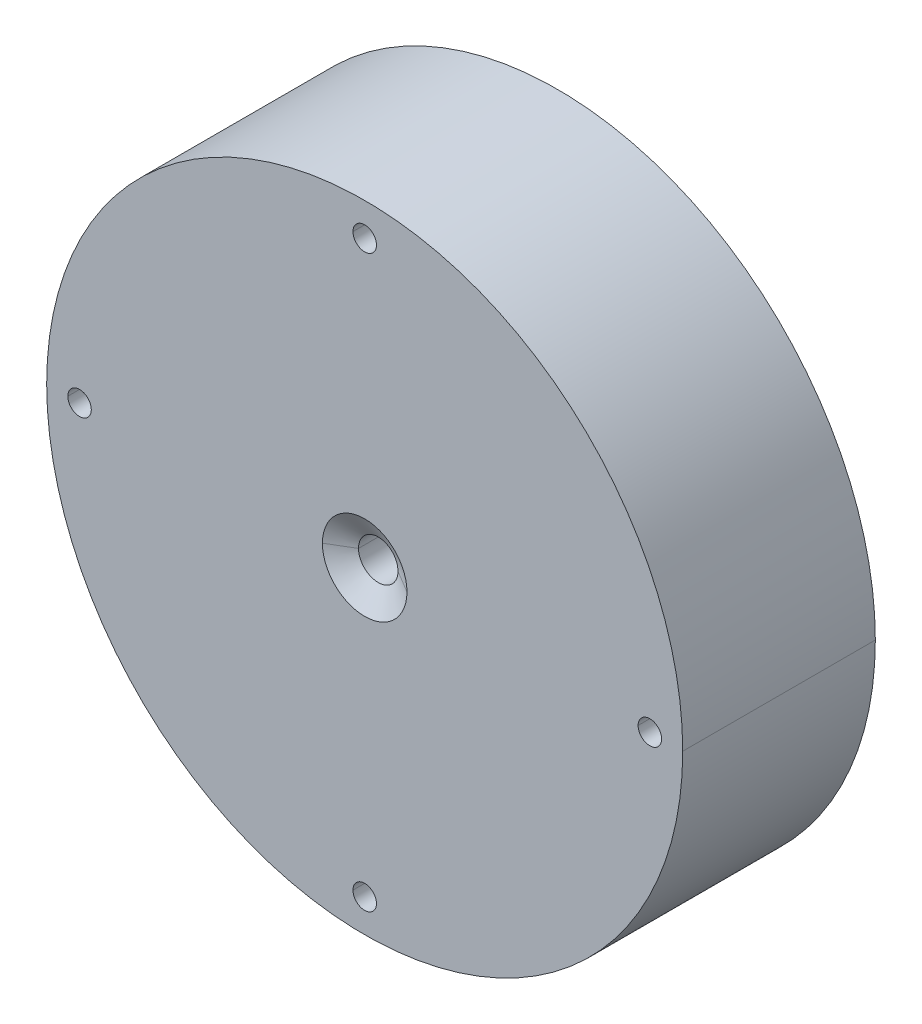
ISO-10303-21;
HEADER;
FILE_DESCRIPTION(('STEP AP214'),'2;1');
FILE_NAME('part.step','',(''),(''),'','','');
FILE_SCHEMA(('AUTOMOTIVE_DESIGN { 1 0 10303 214 1 1 1 1 }'));
ENDSEC;
DATA;
#1=APPLICATION_CONTEXT('core data for automotive mechanical design processes');
#2=APPLICATION_PROTOCOL_DEFINITION('international standard','automotive_design',2000,#1);
#3=PRODUCT_CONTEXT('',#1,'mechanical');
#4=PRODUCT('Part','Part','',(#3));
#5=PRODUCT_RELATED_PRODUCT_CATEGORY('part','',(#4));
#6=PRODUCT_DEFINITION_FORMATION('','',#4);
#7=PRODUCT_DEFINITION_CONTEXT('part definition',#1,'design');
#8=PRODUCT_DEFINITION('design','',#6,#7);
#9=PRODUCT_DEFINITION_SHAPE('','',#8);
#10=(LENGTH_UNIT() NAMED_UNIT(*) SI_UNIT(.MILLI.,.METRE.));
#11=(NAMED_UNIT(*) PLANE_ANGLE_UNIT() SI_UNIT($,.RADIAN.));
#12=(NAMED_UNIT(*) SI_UNIT($,.STERADIAN.) SOLID_ANGLE_UNIT());
#13=UNCERTAINTY_MEASURE_WITH_UNIT(LENGTH_MEASURE(1.E-05),#10,'distance_accuracy_value','');
#14=(GEOMETRIC_REPRESENTATION_CONTEXT(3) GLOBAL_UNCERTAINTY_ASSIGNED_CONTEXT((#13)) GLOBAL_UNIT_ASSIGNED_CONTEXT((#10,
#11,#12)) REPRESENTATION_CONTEXT('',''));
#15=CARTESIAN_POINT('',(0.,0.,0.));
#16=DIRECTION('',(0.,0.,1.));
#17=DIRECTION('',(1.,0.,0.));
#18=AXIS2_PLACEMENT_3D('',#15,#16,#17);
#19=CARTESIAN_POINT('',(0.,0.,0.));
#20=DIRECTION('',(0.,0.,-1.));
#21=DIRECTION('',(-1.,0.,0.));
#22=AXIS2_PLACEMENT_3D('',#19,#20,#21);
#23=CONICAL_SURFACE('',#22,4.5,1.02974425867666);
#24=CARTESIAN_POINT('',(0.,0.,1.44206548566615));
#25=DIRECTION('',(0.,0.,-1.));
#26=DIRECTION('',(1.,0.,0.));
#27=AXIS2_PLACEMENT_3D('',#24,#25,#26);
#28=CIRCLE('',#27,2.1);
#29=CARTESIAN_POINT('',(2.1,0.,1.44206548566615));
#30=VERTEX_POINT('',#29);
#31=CARTESIAN_POINT('',(-2.1,0.,1.44206548566615));
#32=VERTEX_POINT('',#31);
#33=EDGE_CURVE('E42',#30,#32,#28,.T.);
#34=ORIENTED_EDGE('',*,*,#33,.F.);
#35=DIRECTION('',(0.857167300702113,0.,-0.515038074910053));
#36=VECTOR('',#35,1.);
#37=CARTESIAN_POINT('',(4.5,0.,0.));
#38=LINE('',#37,#36);
#39=CARTESIAN_POINT('',(4.5,0.,0.));
#40=VERTEX_POINT('',#39);
#41=EDGE_CURVE('E11',#30,#40,#38,.T.);
#42=ORIENTED_EDGE('',*,*,#41,.T.);
#43=CARTESIAN_POINT('',(0.,0.,0.));
#44=DIRECTION('',(0.,0.,1.));
#45=DIRECTION('',(1.,0.,0.));
#46=AXIS2_PLACEMENT_3D('',#43,#44,#45);
#47=CIRCLE('',#46,4.5);
#48=CARTESIAN_POINT('',(-4.5,0.,0.));
#49=VERTEX_POINT('',#48);
#50=EDGE_CURVE('E175',#49,#40,#47,.T.);
#51=ORIENTED_EDGE('',*,*,#50,.F.);
#52=DIRECTION('',(-0.857167300702113,0.,-0.515038074910053));
#53=VECTOR('',#52,1.);
#54=CARTESIAN_POINT('',(-4.5,0.,0.));
#55=LINE('',#54,#53);
#56=EDGE_CURVE('E163',#32,#49,#55,.T.);
#57=ORIENTED_EDGE('',*,*,#56,.F.);
#58=EDGE_LOOP('',(#34,#42,#51,#57));
#59=FACE_BOUND('',#58,.T.);
#60=ADVANCED_FACE('F17',(#59),#23,.F.);
#61=CARTESIAN_POINT('',(30.35,3.1789956002901E-13,20.5));
#62=DIRECTION('',(0.,0.,1.));
#63=DIRECTION('',(1.,0.,0.));
#64=AXIS2_PLACEMENT_3D('',#61,#62,#63);
#65=CYLINDRICAL_SURFACE('',#64,1.24999999999998);
#66=CARTESIAN_POINT('',(30.35,3.1789956002901E-13,0.));
#67=DIRECTION('',(0.,0.,1.));
#68=DIRECTION('',(1.,0.,0.));
#69=AXIS2_PLACEMENT_3D('',#66,#67,#68);
#70=CIRCLE('',#69,1.25);
#71=CARTESIAN_POINT('',(29.1,3.18052640878903E-13,0.));
#72=VERTEX_POINT('',#71);
#73=CARTESIAN_POINT('',(31.6,3.1789956002901E-13,0.));
#74=VERTEX_POINT('',#73);
#75=EDGE_CURVE('E21',#72,#74,#70,.T.);
#76=ORIENTED_EDGE('',*,*,#75,.F.);
#77=DIRECTION('',(0.,0.,1.));
#78=VECTOR('',#77,1.);
#79=CARTESIAN_POINT('',(29.1,3.18052640878903E-13,20.5));
#80=LINE('',#79,#78);
#81=CARTESIAN_POINT('',(29.1,3.18052640878903E-13,20.5));
#82=VERTEX_POINT('',#81);
#83=EDGE_CURVE('E28',#72,#82,#80,.T.);
#84=ORIENTED_EDGE('',*,*,#83,.T.);
#85=CARTESIAN_POINT('',(30.35,3.1789956002901E-13,20.5));
#86=DIRECTION('',(0.,0.,1.));
#87=DIRECTION('',(1.,0.,0.));
#88=AXIS2_PLACEMENT_3D('',#85,#86,#87);
#89=CIRCLE('',#88,1.24999999999998);
#90=CARTESIAN_POINT('',(31.6,3.1789956002901E-13,20.5));
#91=VERTEX_POINT('',#90);
#92=EDGE_CURVE('E218',#82,#91,#89,.T.);
#93=ORIENTED_EDGE('',*,*,#92,.T.);
#94=DIRECTION('',(0.,0.,1.));
#95=VECTOR('',#94,1.);
#96=CARTESIAN_POINT('',(31.6,3.1789956002901E-13,20.5));
#97=LINE('',#96,#95);
#98=EDGE_CURVE('E251',#74,#91,#97,.T.);
#99=ORIENTED_EDGE('',*,*,#98,.F.);
#100=EDGE_LOOP('',(#76,#84,#93,#99));
#101=FACE_BOUND('',#100,.T.);
#102=ADVANCED_FACE('F297',(#101),#65,.F.);
#103=CARTESIAN_POINT('',(2.11933040019339E-13,-30.35,20.5));
#104=DIRECTION('',(0.,0.,1.));
#105=DIRECTION('',(1.,0.,0.));
#106=AXIS2_PLACEMENT_3D('',#103,#104,#105);
#107=CYLINDRICAL_SURFACE('',#106,1.25);
#108=CARTESIAN_POINT('',(2.11933040019339E-13,-30.35,0.));
#109=DIRECTION('',(0.,0.,1.));
#110=DIRECTION('',(1.,0.,0.));
#111=AXIS2_PLACEMENT_3D('',#108,#109,#110);
#112=CIRCLE('',#111,1.25);
#113=CARTESIAN_POINT('',(-1.24999999999978,-30.35,0.));
#114=VERTEX_POINT('',#113);
#115=CARTESIAN_POINT('',(1.25000000000021,-30.35,0.));
#116=VERTEX_POINT('',#115);
#117=EDGE_CURVE('E262',#114,#116,#112,.T.);
#118=ORIENTED_EDGE('',*,*,#117,.F.);
#119=DIRECTION('',(0.,0.,1.));
#120=VECTOR('',#119,1.);
#121=CARTESIAN_POINT('',(-1.24999999999978,-30.35,20.5));
#122=LINE('',#121,#120);
#123=CARTESIAN_POINT('',(-1.24999999999978,-30.35,20.5));
#124=VERTEX_POINT('',#123);
#125=EDGE_CURVE('E237',#114,#124,#122,.T.);
#126=ORIENTED_EDGE('',*,*,#125,.T.);
#127=CARTESIAN_POINT('',(2.11933040019339E-13,-30.35,20.5));
#128=DIRECTION('',(0.,0.,1.));
#129=DIRECTION('',(1.,0.,0.));
#130=AXIS2_PLACEMENT_3D('',#127,#128,#129);
#131=CIRCLE('',#130,1.24999999999999);
#132=CARTESIAN_POINT('',(1.2500000000002,-30.35,20.5));
#133=VERTEX_POINT('',#132);
#134=EDGE_CURVE('E233',#124,#133,#131,.T.);
#135=ORIENTED_EDGE('',*,*,#134,.T.);
#136=DIRECTION('',(0.,0.,1.));
#137=VECTOR('',#136,1.);
#138=CARTESIAN_POINT('',(1.2500000000002,-30.35,20.5));
#139=LINE('',#138,#137);
#140=EDGE_CURVE('E211',#116,#133,#139,.T.);
#141=ORIENTED_EDGE('',*,*,#140,.F.);
#142=EDGE_LOOP('',(#118,#126,#135,#141));
#143=FACE_BOUND('',#142,.T.);
#144=ADVANCED_FACE('F389',(#143),#107,.F.);
#145=CARTESIAN_POINT('',(-30.35,-1.0596652000967E-13,20.5));
#146=DIRECTION('',(0.,0.,1.));
#147=DIRECTION('',(1.,0.,0.));
#148=AXIS2_PLACEMENT_3D('',#145,#146,#147);
#149=CYLINDRICAL_SURFACE('',#148,1.25);
#150=CARTESIAN_POINT('',(-30.35,-1.0596652000967E-13,0.));
#151=DIRECTION('',(0.,0.,1.));
#152=DIRECTION('',(1.,0.,0.));
#153=AXIS2_PLACEMENT_3D('',#150,#151,#152);
#154=CIRCLE('',#153,1.25);
#155=CARTESIAN_POINT('',(-31.6,-1.05813439159776E-13,0.));
#156=VERTEX_POINT('',#155);
#157=CARTESIAN_POINT('',(-29.1,-1.0596652000967E-13,0.));
#158=VERTEX_POINT('',#157);
#159=EDGE_CURVE('E239',#156,#158,#154,.T.);
#160=ORIENTED_EDGE('',*,*,#159,.F.);
#161=DIRECTION('',(0.,0.,1.));
#162=VECTOR('',#161,1.);
#163=CARTESIAN_POINT('',(-31.6,-1.05813439159776E-13,20.5));
#164=LINE('',#163,#162);
#165=CARTESIAN_POINT('',(-31.6,-1.05813439159776E-13,20.5));
#166=VERTEX_POINT('',#165);
#167=EDGE_CURVE('E238',#156,#166,#164,.T.);
#168=ORIENTED_EDGE('',*,*,#167,.T.);
#169=CARTESIAN_POINT('',(-30.35,-1.0596652000967E-13,20.5));
#170=DIRECTION('',(0.,0.,1.));
#171=DIRECTION('',(1.,0.,0.));
#172=AXIS2_PLACEMENT_3D('',#169,#170,#171);
#173=CIRCLE('',#172,1.24999999999999);
#174=CARTESIAN_POINT('',(-29.1,-1.0596652000967E-13,20.5));
#175=VERTEX_POINT('',#174);
#176=EDGE_CURVE('E270',#166,#175,#173,.T.);
#177=ORIENTED_EDGE('',*,*,#176,.T.);
#178=DIRECTION('',(0.,0.,1.));
#179=VECTOR('',#178,1.);
#180=CARTESIAN_POINT('',(-29.1,-1.0596652000967E-13,20.5));
#181=LINE('',#180,#179);
#182=EDGE_CURVE('E210',#158,#175,#181,.T.);
#183=ORIENTED_EDGE('',*,*,#182,.F.);
#184=EDGE_LOOP('',(#160,#168,#177,#183));
#185=FACE_BOUND('',#184,.T.);
#186=ADVANCED_FACE('F338',(#185),#149,.F.);
#187=CARTESIAN_POINT('',(0.,30.35,20.5));
#188=DIRECTION('',(0.,0.,1.));
#189=DIRECTION('',(1.,0.,0.));
#190=AXIS2_PLACEMENT_3D('',#187,#188,#189);
#191=CYLINDRICAL_SURFACE('',#190,1.25);
#192=CARTESIAN_POINT('',(0.,30.35,0.));
#193=DIRECTION('',(0.,0.,1.));
#194=DIRECTION('',(1.,0.,0.));
#195=AXIS2_PLACEMENT_3D('',#192,#193,#194);
#196=CIRCLE('',#195,1.25);
#197=CARTESIAN_POINT('',(-1.25,30.35,0.));
#198=VERTEX_POINT('',#197);
#199=CARTESIAN_POINT('',(1.25,30.35,0.));
#200=VERTEX_POINT('',#199);
#201=EDGE_CURVE('E250',#198,#200,#196,.T.);
#202=ORIENTED_EDGE('',*,*,#201,.F.);
#203=DIRECTION('',(0.,0.,1.));
#204=VECTOR('',#203,1.);
#205=CARTESIAN_POINT('',(-1.25,30.35,20.5));
#206=LINE('',#205,#204);
#207=CARTESIAN_POINT('',(-1.24999999999999,30.35,20.5));
#208=VERTEX_POINT('',#207);
#209=EDGE_CURVE('E267',#198,#208,#206,.T.);
#210=ORIENTED_EDGE('',*,*,#209,.T.);
#211=CARTESIAN_POINT('',(0.,30.35,20.5));
#212=DIRECTION('',(0.,0.,1.));
#213=DIRECTION('',(1.,0.,0.));
#214=AXIS2_PLACEMENT_3D('',#211,#212,#213);
#215=CIRCLE('',#214,1.24999999999999);
#216=CARTESIAN_POINT('',(1.24999999999999,30.35,20.5));
#217=VERTEX_POINT('',#216);
#218=EDGE_CURVE('E123',#208,#217,#215,.T.);
#219=ORIENTED_EDGE('',*,*,#218,.T.);
#220=DIRECTION('',(0.,0.,1.));
#221=VECTOR('',#220,1.);
#222=CARTESIAN_POINT('',(1.25,30.35,20.5));
#223=LINE('',#222,#221);
#224=EDGE_CURVE('E134',#200,#217,#223,.T.);
#225=ORIENTED_EDGE('',*,*,#224,.F.);
#226=EDGE_LOOP('',(#202,#210,#219,#225));
#227=FACE_BOUND('',#226,.T.);
#228=ADVANCED_FACE('F351',(#227),#191,.F.);
#229=CARTESIAN_POINT('',(0.,0.,19.0579345143338));
#230=DIRECTION('',(0.,0.,1.));
#231=DIRECTION('',(1.,0.,0.));
#232=AXIS2_PLACEMENT_3D('',#229,#230,#231);
#233=CONICAL_SURFACE('',#232,2.1,1.02974425867665);
#234=CARTESIAN_POINT('',(0.,0.,19.0579345143338));
#235=DIRECTION('',(0.,0.,1.));
#236=DIRECTION('',(1.,0.,0.));
#237=AXIS2_PLACEMENT_3D('',#234,#235,#236);
#238=CIRCLE('',#237,2.1);
#239=CARTESIAN_POINT('',(-2.1,0.,19.0579345143338));
#240=VERTEX_POINT('',#239);
#241=CARTESIAN_POINT('',(2.1,0.,19.0579345143338));
#242=VERTEX_POINT('',#241);
#243=EDGE_CURVE('E195',#240,#242,#238,.T.);
#244=ORIENTED_EDGE('',*,*,#243,.F.);
#245=DIRECTION('',(-0.857167300702112,0.,0.515038074910055));
#246=VECTOR('',#245,1.);
#247=CARTESIAN_POINT('',(-2.1,0.,19.0579345143338));
#248=LINE('',#247,#246);
#249=CARTESIAN_POINT('',(-4.5,0.,20.5));
#250=VERTEX_POINT('',#249);
#251=EDGE_CURVE('E198',#240,#250,#248,.T.);
#252=ORIENTED_EDGE('',*,*,#251,.T.);
#253=CARTESIAN_POINT('',(0.,0.,20.5));
#254=DIRECTION('',(0.,0.,-1.));
#255=DIRECTION('',(1.,0.,0.));
#256=AXIS2_PLACEMENT_3D('',#253,#254,#255);
#257=CIRCLE('',#256,4.5);
#258=CARTESIAN_POINT('',(4.5,0.,20.5));
#259=VERTEX_POINT('',#258);
#260=EDGE_CURVE('E205',#259,#250,#257,.T.);
#261=ORIENTED_EDGE('',*,*,#260,.F.);
#262=DIRECTION('',(0.857167300702112,0.,0.515038074910055));
#263=VECTOR('',#262,1.);
#264=CARTESIAN_POINT('',(2.1,0.,19.0579345143338));
#265=LINE('',#264,#263);
#266=EDGE_CURVE('E228',#242,#259,#265,.T.);
#267=ORIENTED_EDGE('',*,*,#266,.F.);
#268=EDGE_LOOP('',(#244,#252,#261,#267));
#269=FACE_BOUND('',#268,.T.);
#270=ADVANCED_FACE('F363',(#269),#233,.F.);
#271=CARTESIAN_POINT('',(0.,0.,20.5));
#272=DIRECTION('',(0.,0.,-1.));
#273=DIRECTION('',(-1.,0.,0.));
#274=AXIS2_PLACEMENT_3D('',#271,#272,#273);
#275=CYLINDRICAL_SURFACE('',#274,2.1);
#276=ORIENTED_EDGE('',*,*,#243,.T.);
#277=DIRECTION('',(0.,0.,-1.));
#278=VECTOR('',#277,1.);
#279=CARTESIAN_POINT('',(2.1,0.,20.5));
#280=LINE('',#279,#278);
#281=EDGE_CURVE('E199',#242,#30,#280,.T.);
#282=ORIENTED_EDGE('',*,*,#281,.T.);
#283=ORIENTED_EDGE('',*,*,#33,.T.);
#284=DIRECTION('',(0.,0.,-1.));
#285=VECTOR('',#284,1.);
#286=CARTESIAN_POINT('',(-2.1,0.,20.5));
#287=LINE('',#286,#285);
#288=EDGE_CURVE('E222',#240,#32,#287,.T.);
#289=ORIENTED_EDGE('',*,*,#288,.F.);
#290=EDGE_LOOP('',(#276,#282,#283,#289));
#291=FACE_BOUND('',#290,.T.);
#292=ADVANCED_FACE('F371',(#291),#275,.F.);
#293=CARTESIAN_POINT('',(0.,0.,20.5));
#294=DIRECTION('',(0.,0.,-1.));
#295=DIRECTION('',(-1.,0.,0.));
#296=AXIS2_PLACEMENT_3D('',#293,#294,#295);
#297=CYLINDRICAL_SURFACE('',#296,33.85);
#298=CARTESIAN_POINT('',(0.,0.,20.5));
#299=DIRECTION('',(0.,0.,1.));
#300=DIRECTION('',(1.,0.,0.));
#301=AXIS2_PLACEMENT_3D('',#298,#299,#300);
#302=CIRCLE('',#301,33.85);
#303=CARTESIAN_POINT('',(33.85,0.,20.5));
#304=VERTEX_POINT('',#303);
#305=CARTESIAN_POINT('',(-33.85,0.,20.5));
#306=VERTEX_POINT('',#305);
#307=EDGE_CURVE('E201',#304,#306,#302,.T.);
#308=ORIENTED_EDGE('',*,*,#307,.F.);
#309=DIRECTION('',(0.,0.,-1.));
#310=VECTOR('',#309,1.);
#311=CARTESIAN_POINT('',(33.85,0.,20.5));
#312=LINE('',#311,#310);
#313=CARTESIAN_POINT('',(33.85,0.,0.));
#314=VERTEX_POINT('',#313);
#315=EDGE_CURVE('E221',#304,#314,#312,.T.);
#316=ORIENTED_EDGE('',*,*,#315,.T.);
#317=CARTESIAN_POINT('',(0.,0.,0.));
#318=DIRECTION('',(0.,0.,1.));
#319=DIRECTION('',(1.,0.,0.));
#320=AXIS2_PLACEMENT_3D('',#317,#318,#319);
#321=CIRCLE('',#320,33.85);
#322=CARTESIAN_POINT('',(-33.85,0.,0.));
#323=VERTEX_POINT('',#322);
#324=EDGE_CURVE('E318',#314,#323,#321,.T.);
#325=ORIENTED_EDGE('',*,*,#324,.T.);
#326=DIRECTION('',(0.,0.,-1.));
#327=VECTOR('',#326,1.);
#328=CARTESIAN_POINT('',(-33.85,0.,20.5));
#329=LINE('',#328,#327);
#330=EDGE_CURVE('E278',#306,#323,#329,.T.);
#331=ORIENTED_EDGE('',*,*,#330,.F.);
#332=EDGE_LOOP('',(#308,#316,#325,#331));
#333=FACE_BOUND('',#332,.T.);
#334=ADVANCED_FACE('F354',(#333),#297,.T.);
#335=CARTESIAN_POINT('',(0.,0.,20.5));
#336=DIRECTION('',(0.,0.,1.));
#337=DIRECTION('',(1.,0.,0.));
#338=AXIS2_PLACEMENT_3D('',#335,#336,#337);
#339=PLANE('',#338);
#340=CARTESIAN_POINT('',(0.,0.,20.5));
#341=DIRECTION('',(0.,0.,1.));
#342=DIRECTION('',(1.,0.,0.));
#343=AXIS2_PLACEMENT_3D('',#340,#341,#342);
#344=CIRCLE('',#343,33.85);
#345=EDGE_CURVE('E192',#306,#304,#344,.T.);
#346=ORIENTED_EDGE('',*,*,#345,.T.);
#347=ORIENTED_EDGE('',*,*,#307,.T.);
#348=EDGE_LOOP('',(#346,#347));
#349=FACE_BOUND('',#348,.T.);
#350=CARTESIAN_POINT('',(30.35,3.1789956002901E-13,20.5));
#351=DIRECTION('',(0.,0.,1.));
#352=DIRECTION('',(1.,0.,0.));
#353=AXIS2_PLACEMENT_3D('',#350,#351,#352);
#354=CIRCLE('',#353,1.24999999999998);
#355=EDGE_CURVE('E173',#91,#82,#354,.T.);
#356=ORIENTED_EDGE('',*,*,#355,.F.);
#357=ORIENTED_EDGE('',*,*,#92,.F.);
#358=EDGE_LOOP('',(#356,#357));
#359=FACE_BOUND('',#358,.T.);
#360=CARTESIAN_POINT('',(2.11933040019339E-13,-30.35,20.5));
#361=DIRECTION('',(0.,0.,1.));
#362=DIRECTION('',(1.,0.,0.));
#363=AXIS2_PLACEMENT_3D('',#360,#361,#362);
#364=CIRCLE('',#363,1.24999999999999);
#365=EDGE_CURVE('E254',#133,#124,#364,.T.);
#366=ORIENTED_EDGE('',*,*,#365,.F.);
#367=ORIENTED_EDGE('',*,*,#134,.F.);
#368=EDGE_LOOP('',(#366,#367));
#369=FACE_BOUND('',#368,.T.);
#370=CARTESIAN_POINT('',(-30.35,-1.0596652000967E-13,20.5));
#371=DIRECTION('',(0.,0.,1.));
#372=DIRECTION('',(1.,0.,0.));
#373=AXIS2_PLACEMENT_3D('',#370,#371,#372);
#374=CIRCLE('',#373,1.24999999999999);
#375=EDGE_CURVE('E206',#175,#166,#374,.T.);
#376=ORIENTED_EDGE('',*,*,#375,.F.);
#377=ORIENTED_EDGE('',*,*,#176,.F.);
#378=EDGE_LOOP('',(#376,#377));
#379=FACE_BOUND('',#378,.T.);
#380=CARTESIAN_POINT('',(0.,30.35,20.5));
#381=DIRECTION('',(0.,0.,1.));
#382=DIRECTION('',(1.,0.,0.));
#383=AXIS2_PLACEMENT_3D('',#380,#381,#382);
#384=CIRCLE('',#383,1.24999999999999);
#385=EDGE_CURVE('E229',#217,#208,#384,.T.);
#386=ORIENTED_EDGE('',*,*,#385,.F.);
#387=ORIENTED_EDGE('',*,*,#218,.F.);
#388=EDGE_LOOP('',(#386,#387));
#389=FACE_BOUND('',#388,.T.);
#390=ORIENTED_EDGE('',*,*,#260,.T.);
#391=CARTESIAN_POINT('',(0.,0.,20.5));
#392=DIRECTION('',(0.,0.,-1.));
#393=DIRECTION('',(1.,0.,0.));
#394=AXIS2_PLACEMENT_3D('',#391,#392,#393);
#395=CIRCLE('',#394,4.5);
#396=EDGE_CURVE('E178',#250,#259,#395,.T.);
#397=ORIENTED_EDGE('',*,*,#396,.T.);
#398=EDGE_LOOP('',(#390,#397));
#399=FACE_BOUND('',#398,.T.);
#400=ADVANCED_FACE('F302',(#349,#359,#369,#379,#389,#399),#339,.T.);
#401=CARTESIAN_POINT('',(0.,0.,0.));
#402=DIRECTION('',(0.,0.,1.));
#403=DIRECTION('',(1.,0.,0.));
#404=AXIS2_PLACEMENT_3D('',#401,#402,#403);
#405=PLANE('',#404);
#406=CARTESIAN_POINT('',(0.,0.,0.));
#407=DIRECTION('',(0.,0.,1.));
#408=DIRECTION('',(1.,0.,0.));
#409=AXIS2_PLACEMENT_3D('',#406,#407,#408);
#410=CIRCLE('',#409,33.85);
#411=EDGE_CURVE('E274',#323,#314,#410,.T.);
#412=ORIENTED_EDGE('',*,*,#411,.F.);
#413=ORIENTED_EDGE('',*,*,#324,.F.);
#414=EDGE_LOOP('',(#412,#413));
#415=FACE_BOUND('',#414,.T.);
#416=ORIENTED_EDGE('',*,*,#50,.T.);
#417=CARTESIAN_POINT('',(0.,0.,0.));
#418=DIRECTION('',(0.,0.,1.));
#419=DIRECTION('',(1.,0.,0.));
#420=AXIS2_PLACEMENT_3D('',#417,#418,#419);
#421=CIRCLE('',#420,4.5);
#422=EDGE_CURVE('E168',#40,#49,#421,.T.);
#423=ORIENTED_EDGE('',*,*,#422,.T.);
#424=EDGE_LOOP('',(#416,#423));
#425=FACE_BOUND('',#424,.T.);
#426=CARTESIAN_POINT('',(30.35,3.1789956002901E-13,0.));
#427=DIRECTION('',(0.,0.,1.));
#428=DIRECTION('',(1.,0.,0.));
#429=AXIS2_PLACEMENT_3D('',#426,#427,#428);
#430=CIRCLE('',#429,1.25);
#431=EDGE_CURVE('E183',#74,#72,#430,.T.);
#432=ORIENTED_EDGE('',*,*,#431,.T.);
#433=ORIENTED_EDGE('',*,*,#75,.T.);
#434=EDGE_LOOP('',(#432,#433));
#435=FACE_BOUND('',#434,.T.);
#436=CARTESIAN_POINT('',(2.11933040019339E-13,-30.35,0.));
#437=DIRECTION('',(0.,0.,1.));
#438=DIRECTION('',(1.,0.,0.));
#439=AXIS2_PLACEMENT_3D('',#436,#437,#438);
#440=CIRCLE('',#439,1.25);
#441=EDGE_CURVE('E266',#116,#114,#440,.T.);
#442=ORIENTED_EDGE('',*,*,#441,.T.);
#443=ORIENTED_EDGE('',*,*,#117,.T.);
#444=EDGE_LOOP('',(#442,#443));
#445=FACE_BOUND('',#444,.T.);
#446=CARTESIAN_POINT('',(-30.35,-1.0596652000967E-13,0.));
#447=DIRECTION('',(0.,0.,1.));
#448=DIRECTION('',(1.,0.,0.));
#449=AXIS2_PLACEMENT_3D('',#446,#447,#448);
#450=CIRCLE('',#449,1.25);
#451=EDGE_CURVE('E243',#158,#156,#450,.T.);
#452=ORIENTED_EDGE('',*,*,#451,.T.);
#453=ORIENTED_EDGE('',*,*,#159,.T.);
#454=EDGE_LOOP('',(#452,#453));
#455=FACE_BOUND('',#454,.T.);
#456=CARTESIAN_POINT('',(0.,30.35,0.));
#457=DIRECTION('',(0.,0.,1.));
#458=DIRECTION('',(1.,0.,0.));
#459=AXIS2_PLACEMENT_3D('',#456,#457,#458);
#460=CIRCLE('',#459,1.25);
#461=EDGE_CURVE('E244',#200,#198,#460,.T.);
#462=ORIENTED_EDGE('',*,*,#461,.T.);
#463=ORIENTED_EDGE('',*,*,#201,.T.);
#464=EDGE_LOOP('',(#462,#463));
#465=FACE_BOUND('',#464,.T.);
#466=ADVANCED_FACE('F180',(#415,#425,#435,#445,#455,#465),#405,.F.);
#467=CARTESIAN_POINT('',(0.,0.,20.5));
#468=DIRECTION('',(0.,0.,-1.));
#469=DIRECTION('',(-1.,0.,0.));
#470=AXIS2_PLACEMENT_3D('',#467,#468,#469);
#471=CYLINDRICAL_SURFACE('',#470,33.85);
#472=ORIENTED_EDGE('',*,*,#315,.F.);
#473=ORIENTED_EDGE('',*,*,#345,.F.);
#474=ORIENTED_EDGE('',*,*,#330,.T.);
#475=ORIENTED_EDGE('',*,*,#411,.T.);
#476=EDGE_LOOP('',(#472,#473,#474,#475));
#477=FACE_BOUND('',#476,.T.);
#478=ADVANCED_FACE('F19',(#477),#471,.T.);
#479=CARTESIAN_POINT('',(0.,0.,20.5));
#480=DIRECTION('',(0.,0.,-1.));
#481=DIRECTION('',(-1.,0.,0.));
#482=AXIS2_PLACEMENT_3D('',#479,#480,#481);
#483=CYLINDRICAL_SURFACE('',#482,2.1);
#484=ORIENTED_EDGE('',*,*,#281,.F.);
#485=CARTESIAN_POINT('',(0.,0.,19.0579345143338));
#486=DIRECTION('',(0.,0.,1.));
#487=DIRECTION('',(1.,0.,0.));
#488=AXIS2_PLACEMENT_3D('',#485,#486,#487);
#489=CIRCLE('',#488,2.1);
#490=EDGE_CURVE('E225',#242,#240,#489,.T.);
#491=ORIENTED_EDGE('',*,*,#490,.T.);
#492=ORIENTED_EDGE('',*,*,#288,.T.);
#493=CARTESIAN_POINT('',(0.,0.,1.44206548566615));
#494=DIRECTION('',(0.,0.,-1.));
#495=DIRECTION('',(1.,0.,0.));
#496=AXIS2_PLACEMENT_3D('',#493,#494,#495);
#497=CIRCLE('',#496,2.1);
#498=EDGE_CURVE('E170',#32,#30,#497,.T.);
#499=ORIENTED_EDGE('',*,*,#498,.T.);
#500=EDGE_LOOP('',(#484,#491,#492,#499));
#501=FACE_BOUND('',#500,.T.);
#502=ADVANCED_FACE('F369',(#501),#483,.F.);
#503=CARTESIAN_POINT('',(0.,0.,19.0579345143338));
#504=DIRECTION('',(0.,0.,1.));
#505=DIRECTION('',(1.,0.,0.));
#506=AXIS2_PLACEMENT_3D('',#503,#504,#505);
#507=CONICAL_SURFACE('',#506,2.1,1.02974425867665);
#508=ORIENTED_EDGE('',*,*,#251,.F.);
#509=ORIENTED_EDGE('',*,*,#490,.F.);
#510=ORIENTED_EDGE('',*,*,#266,.T.);
#511=ORIENTED_EDGE('',*,*,#396,.F.);
#512=EDGE_LOOP('',(#508,#509,#510,#511));
#513=FACE_BOUND('',#512,.T.);
#514=ADVANCED_FACE('F366',(#513),#507,.F.);
#515=CARTESIAN_POINT('',(0.,30.35,20.5));
#516=DIRECTION('',(0.,0.,1.));
#517=DIRECTION('',(1.,0.,0.));
#518=AXIS2_PLACEMENT_3D('',#515,#516,#517);
#519=CYLINDRICAL_SURFACE('',#518,1.25);
#520=ORIENTED_EDGE('',*,*,#209,.F.);
#521=ORIENTED_EDGE('',*,*,#461,.F.);
#522=ORIENTED_EDGE('',*,*,#224,.T.);
#523=ORIENTED_EDGE('',*,*,#385,.T.);
#524=EDGE_LOOP('',(#520,#521,#522,#523));
#525=FACE_BOUND('',#524,.T.);
#526=ADVANCED_FACE('F350',(#525),#519,.F.);
#527=CARTESIAN_POINT('',(-30.35,-1.0596652000967E-13,20.5));
#528=DIRECTION('',(0.,0.,1.));
#529=DIRECTION('',(1.,0.,0.));
#530=AXIS2_PLACEMENT_3D('',#527,#528,#529);
#531=CYLINDRICAL_SURFACE('',#530,1.25);
#532=ORIENTED_EDGE('',*,*,#167,.F.);
#533=ORIENTED_EDGE('',*,*,#451,.F.);
#534=ORIENTED_EDGE('',*,*,#182,.T.);
#535=ORIENTED_EDGE('',*,*,#375,.T.);
#536=EDGE_LOOP('',(#532,#533,#534,#535));
#537=FACE_BOUND('',#536,.T.);
#538=ADVANCED_FACE('F342',(#537),#531,.F.);
#539=CARTESIAN_POINT('',(2.11933040019339E-13,-30.35,20.5));
#540=DIRECTION('',(0.,0.,1.));
#541=DIRECTION('',(1.,0.,0.));
#542=AXIS2_PLACEMENT_3D('',#539,#540,#541);
#543=CYLINDRICAL_SURFACE('',#542,1.25);
#544=ORIENTED_EDGE('',*,*,#125,.F.);
#545=ORIENTED_EDGE('',*,*,#441,.F.);
#546=ORIENTED_EDGE('',*,*,#140,.T.);
#547=ORIENTED_EDGE('',*,*,#365,.T.);
#548=EDGE_LOOP('',(#544,#545,#546,#547));
#549=FACE_BOUND('',#548,.T.);
#550=ADVANCED_FACE('F394',(#549),#543,.F.);
#551=CARTESIAN_POINT('',(30.35,3.1789956002901E-13,20.5));
#552=DIRECTION('',(0.,0.,1.));
#553=DIRECTION('',(1.,0.,0.));
#554=AXIS2_PLACEMENT_3D('',#551,#552,#553);
#555=CYLINDRICAL_SURFACE('',#554,1.24999999999998);
#556=ORIENTED_EDGE('',*,*,#83,.F.);
#557=ORIENTED_EDGE('',*,*,#431,.F.);
#558=ORIENTED_EDGE('',*,*,#98,.T.);
#559=ORIENTED_EDGE('',*,*,#355,.T.);
#560=EDGE_LOOP('',(#556,#557,#558,#559));
#561=FACE_BOUND('',#560,.T.);
#562=ADVANCED_FACE('F397',(#561),#555,.F.);
#563=CARTESIAN_POINT('',(0.,0.,0.));
#564=DIRECTION('',(0.,0.,-1.));
#565=DIRECTION('',(-1.,0.,0.));
#566=AXIS2_PLACEMENT_3D('',#563,#564,#565);
#567=CONICAL_SURFACE('',#566,4.5,1.02974425867666);
#568=ORIENTED_EDGE('',*,*,#41,.F.);
#569=ORIENTED_EDGE('',*,*,#498,.F.);
#570=ORIENTED_EDGE('',*,*,#56,.T.);
#571=ORIENTED_EDGE('',*,*,#422,.F.);
#572=EDGE_LOOP('',(#568,#569,#570,#571));
#573=FACE_BOUND('',#572,.T.);
#574=ADVANCED_FACE('F166',(#573),#567,.F.);
#575=CLOSED_SHELL('',(#60,#102,#144,#186,#228,#270,#292,#334,#400,#466,#478,#502,#514,#526,#538,
#550,#562,#574));
#576=MANIFOLD_SOLID_BREP('B1',#575);
#577=ADVANCED_BREP_SHAPE_REPRESENTATION('',(#18,#576),#14);
#578=SHAPE_DEFINITION_REPRESENTATION(#9,#577);
ENDSEC;
END-ISO-10303-21;
